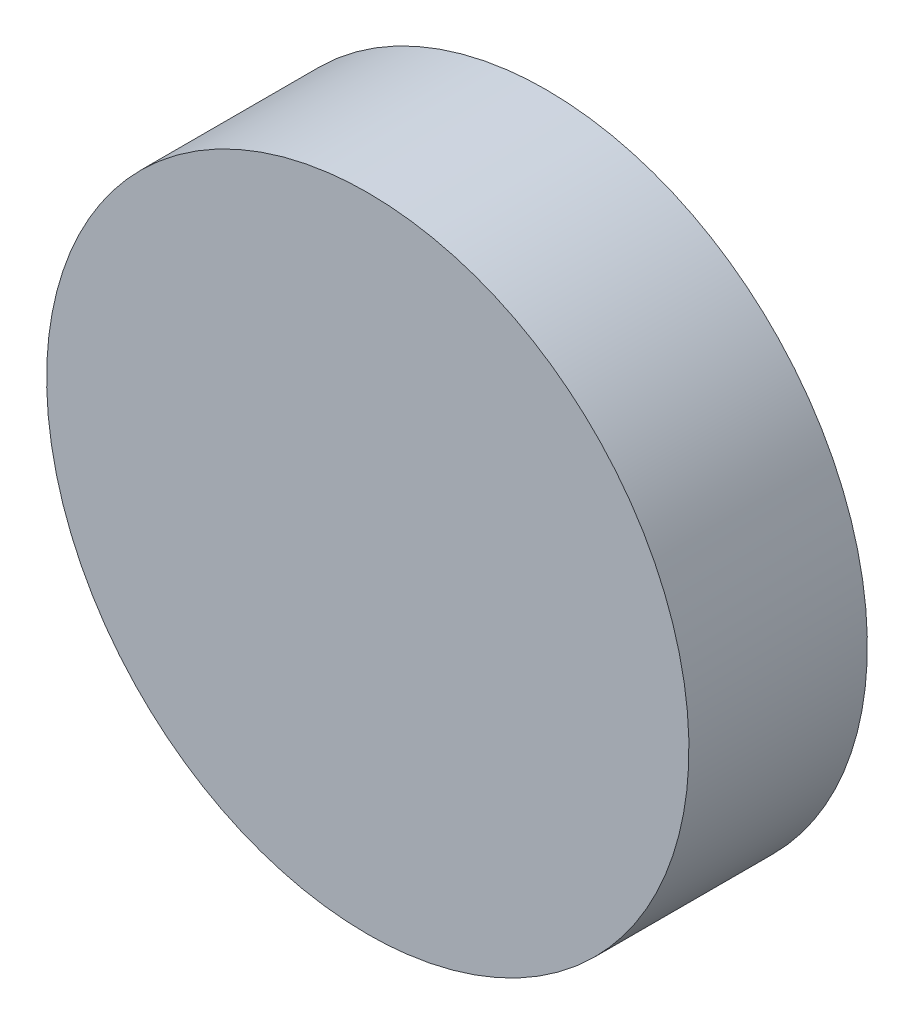
ISO-10303-21;
HEADER;
FILE_DESCRIPTION(('STEP AP214'),'2;1');
FILE_NAME('part.step','',(''),(''),'','','');
FILE_SCHEMA(('AUTOMOTIVE_DESIGN { 1 0 10303 214 1 1 1 1 }'));
ENDSEC;
DATA;
#1=APPLICATION_CONTEXT('core data for automotive mechanical design processes');
#2=APPLICATION_PROTOCOL_DEFINITION('international standard','automotive_design',2000,#1);
#3=PRODUCT_CONTEXT('',#1,'mechanical');
#4=PRODUCT('Part','Part','',(#3));
#5=PRODUCT_RELATED_PRODUCT_CATEGORY('part','',(#4));
#6=PRODUCT_DEFINITION_FORMATION('','',#4);
#7=PRODUCT_DEFINITION_CONTEXT('part definition',#1,'design');
#8=PRODUCT_DEFINITION('design','',#6,#7);
#9=PRODUCT_DEFINITION_SHAPE('','',#8);
#10=(LENGTH_UNIT() NAMED_UNIT(*) SI_UNIT(.MILLI.,.METRE.));
#11=(NAMED_UNIT(*) PLANE_ANGLE_UNIT() SI_UNIT($,.RADIAN.));
#12=(NAMED_UNIT(*) SI_UNIT($,.STERADIAN.) SOLID_ANGLE_UNIT());
#13=UNCERTAINTY_MEASURE_WITH_UNIT(LENGTH_MEASURE(1.E-05),#10,'distance_accuracy_value','');
#14=(GEOMETRIC_REPRESENTATION_CONTEXT(3) GLOBAL_UNCERTAINTY_ASSIGNED_CONTEXT((#13)) GLOBAL_UNIT_ASSIGNED_CONTEXT((#10,
#11,#12)) REPRESENTATION_CONTEXT('',''));
#15=CARTESIAN_POINT('',(0.,0.,0.));
#16=DIRECTION('',(0.,0.,1.));
#17=DIRECTION('',(1.,0.,0.));
#18=AXIS2_PLACEMENT_3D('',#15,#16,#17);
#19=CARTESIAN_POINT('',(-28.9527978690643,4.79877379608722,9.96771335056176E-07));
#20=CARTESIAN_POINT('',(-28.4955978690643,4.79877379063517,9.96771334579543E-07));
#21=CARTESIAN_POINT('',(-28.4955978636122,5.25597379063516,1.03674100853733E-06));
#22=CARTESIAN_POINT('',(-28.4955978581601,5.71317379063516,1.07671068249511E-06));
#23=CARTESIAN_POINT('',(-28.9527978581601,5.71317379608722,1.07671068297174E-06));
#24=CARTESIAN_POINT('',(-29.4099978581601,5.71317380153928,1.07671068344838E-06));
#25=CARTESIAN_POINT('',(-29.4099978636122,5.25597380153928,1.03674100949059E-06));
#26=CARTESIAN_POINT('',(-29.4099978690643,4.79877380153928,9.9677133553281E-07));
#27=CARTESIAN_POINT('',(-28.9527978690643,4.79877379608722,9.96771335056176E-07));
#28=CARTESIAN_POINT('',(-28.9527978690643,4.7987738182926,-0.253999003228664));
#29=CARTESIAN_POINT('',(-28.4955978690643,4.79877381284054,-0.253999003228664));
#30=CARTESIAN_POINT('',(-28.4955978636122,5.25597381284054,-0.253998963258991));
#31=CARTESIAN_POINT('',(-28.4955978581601,5.71317381284054,-0.253998923289317));
#32=CARTESIAN_POINT('',(-28.9527978581601,5.71317381829259,-0.253998923289316));
#33=CARTESIAN_POINT('',(-29.4099978581601,5.71317382374465,-0.253998923289316));
#34=CARTESIAN_POINT('',(-29.4099978636122,5.25597382374465,-0.25399896325899));
#35=CARTESIAN_POINT('',(-29.4099978690643,4.79877382374465,-0.253999003228663));
#36=CARTESIAN_POINT('',(-28.9527978690643,4.7987738182926,-0.253999003228664));
#37=(BOUNDED_SURFACE() B_SPLINE_SURFACE(1,2,((#19,#20,#21,#22,#23,#24,#25,#26,#27),(#28,#29,#30,
#31,#32,#33,#34,#35,#36)),.UNSPECIFIED.,.F.,.T.,.F.) B_SPLINE_SURFACE_WITH_KNOTS((2,2),(3,2,2,2,
3),(-0.555555555555555,0.),(-3.14159265358979,-1.5707963267949,0.,1.5707963267949,
3.14159265358979),.UNSPECIFIED.) GEOMETRIC_REPRESENTATION_ITEM() RATIONAL_B_SPLINE_SURFACE(((1.,
0.707106781186548,1.,0.707106781186548,1.,0.707106781186548,1.,0.707106781186548,1.),(1.,
0.707106781186548,1.,0.707106781186548,1.,0.707106781186548,1.,0.707106781186548,1.))) REPRESENTATION_ITEM('') SURFACE());
#38=CARTESIAN_POINT('',(-28.9527978581601,5.71317379608722,1.07671068297174E-06));
#39=CARTESIAN_POINT('',(-28.4955978581601,5.71317379063512,1.07671068249511E-06));
#40=CARTESIAN_POINT('',(-28.4955978636122,5.25597379063514,1.03674100853732E-06));
#41=CARTESIAN_POINT('',(-28.4955978690643,4.79877379063517,9.96771334579543E-07));
#42=CARTESIAN_POINT('',(-28.9527978690643,4.79877379608722,9.96771335056176E-07));
#43=(BOUNDED_CURVE() B_SPLINE_CURVE(2,(#38,#39,#40,#41,#42),.UNSPECIFIED.,.F.,
.F.) B_SPLINE_CURVE_WITH_KNOTS((3,2,3),(0.,1.57079632679495,3.1415926535898),
.UNSPECIFIED.) CURVE() GEOMETRIC_REPRESENTATION_ITEM() RATIONAL_B_SPLINE_CURVE((1.,
0.707106781186564,1.,0.707106781186554,1.)) REPRESENTATION_ITEM(''));
#44=CARTESIAN_POINT('',(-28.9527978581601,5.71317379608722,1.07671068297175E-06));
#45=VERTEX_POINT('',#44);
#46=CARTESIAN_POINT('',(-28.9527978690643,4.79877379608722,9.96771335056176E-07));
#47=VERTEX_POINT('',#46);
#48=EDGE_CURVE('E50',#45,#47,#43,.T.);
#49=CARTESIAN_POINT('',(-28.9527978690643,4.79877379608722,9.96771335056176E-07));
#50=CARTESIAN_POINT('',(-28.9527978690643,4.7987738182926,-0.253999003228664));
#51=(BOUNDED_CURVE() B_SPLINE_CURVE(1,(#49,#50),.UNSPECIFIED.,.F.,
.F.) B_SPLINE_CURVE_WITH_KNOTS((2,2),(0.,0.555555555555555),
.UNSPECIFIED.) CURVE() GEOMETRIC_REPRESENTATION_ITEM() RATIONAL_B_SPLINE_CURVE((1.,1.)) REPRESENTATION_ITEM(''));
#52=CARTESIAN_POINT('',(-28.9527978690643,4.7987738182926,-0.253999003228664));
#53=VERTEX_POINT('',#52);
#54=EDGE_CURVE('E11',#47,#53,#51,.T.);
#55=CARTESIAN_POINT('',(-28.9527978581601,5.7131738182926,-0.253998923289316));
#56=CARTESIAN_POINT('',(-28.4955978581601,5.7131738128405,-0.253998923289317));
#57=CARTESIAN_POINT('',(-28.4955978636122,5.25597381284052,-0.253998963258991));
#58=CARTESIAN_POINT('',(-28.4955978690643,4.79877381284055,-0.253999003228664));
#59=CARTESIAN_POINT('',(-28.9527978690643,4.7987738182926,-0.253999003228664));
#60=(BOUNDED_CURVE() B_SPLINE_CURVE(2,(#55,#56,#57,#58,#59),.UNSPECIFIED.,.F.,
.F.) B_SPLINE_CURVE_WITH_KNOTS((3,2,3),(0.,1.57079632679495,3.1415926535898),
.UNSPECIFIED.) CURVE() GEOMETRIC_REPRESENTATION_ITEM() RATIONAL_B_SPLINE_CURVE((1.,
0.707106781186564,1.,0.707106781186554,1.)) REPRESENTATION_ITEM(''));
#61=CARTESIAN_POINT('',(-28.9527978581601,5.7131738182926,-0.253998923289317));
#62=VERTEX_POINT('',#61);
#63=EDGE_CURVE('E48',#62,#53,#60,.T.);
#64=CARTESIAN_POINT('',(-28.9527978690643,4.7987738182926,-0.253999003228664));
#65=CARTESIAN_POINT('',(-29.4099978690643,4.79877382374466,-0.253999003228663));
#66=CARTESIAN_POINT('',(-29.4099978636122,5.25597382374468,-0.25399896325899));
#67=CARTESIAN_POINT('',(-29.4099978581601,5.7131738237447,-0.253998923289316));
#68=CARTESIAN_POINT('',(-28.9527978581601,5.7131738182926,-0.253998923289316));
#69=(BOUNDED_CURVE() B_SPLINE_CURVE(2,(#64,#65,#66,#67,#68),.UNSPECIFIED.,.F.,
.F.) B_SPLINE_CURVE_WITH_KNOTS((3,2,3),(3.1415926535898,4.71238898038474,6.28318530717969),
.UNSPECIFIED.) CURVE() GEOMETRIC_REPRESENTATION_ITEM() RATIONAL_B_SPLINE_CURVE((1.,
0.707106781186518,1.,0.70710678118653,1.)) REPRESENTATION_ITEM(''));
#70=EDGE_CURVE('E46',#53,#62,#69,.T.);
#71=CARTESIAN_POINT('',(-28.9527978690643,4.79877379608722,9.96771335056176E-07));
#72=CARTESIAN_POINT('',(-29.4099978690643,4.79877380153928,9.9677133553281E-07));
#73=CARTESIAN_POINT('',(-29.4099978636122,5.2559738015393,1.0367410094906E-06));
#74=CARTESIAN_POINT('',(-29.4099978581601,5.71317380153932,1.07671068344838E-06));
#75=CARTESIAN_POINT('',(-28.9527978581601,5.71317379608722,1.07671068297174E-06));
#76=(BOUNDED_CURVE() B_SPLINE_CURVE(2,(#71,#72,#73,#74,#75),.UNSPECIFIED.,.F.,
.F.) B_SPLINE_CURVE_WITH_KNOTS((3,2,3),(3.1415926535898,4.71238898038474,6.28318530717969),
.UNSPECIFIED.) CURVE() GEOMETRIC_REPRESENTATION_ITEM() RATIONAL_B_SPLINE_CURVE((1.,
0.707106781186518,1.,0.70710678118653,1.)) REPRESENTATION_ITEM(''));
#77=EDGE_CURVE('E30',#47,#45,#76,.T.);
#78=ORIENTED_EDGE('',*,*,#48,.T.);
#79=ORIENTED_EDGE('',*,*,#54,.T.);
#80=ORIENTED_EDGE('',*,*,#63,.F.);
#81=ORIENTED_EDGE('',*,*,#70,.F.);
#82=ORIENTED_EDGE('',*,*,#54,.F.);
#83=ORIENTED_EDGE('',*,*,#77,.T.);
#84=EDGE_LOOP('',(#78,#79,#80,#81,#82,#83));
#85=FACE_BOUND('',#84,.T.);
#86=ADVANCED_FACE('F17',(#85),#37,.T.);
#87=CARTESIAN_POINT('',(-29.5014378570698,5.80461380262974,1.08470461821553E-06));
#88=CARTESIAN_POINT('',(-28.4041578570697,5.80461378954481,1.08470461707161E-06));
#89=CARTESIAN_POINT('',(-29.5014378701547,4.70733380262963,9.88777400716842E-07));
#90=CARTESIAN_POINT('',(-28.4041578701546,4.7073337895447,9.88777399572921E-07));
#91=(BOUNDED_SURFACE() B_SPLINE_SURFACE(1,1,((#87,#88),(#89,#90)),.UNSPECIFIED.,.F.,.F.,
.F.) B_SPLINE_SURFACE_WITH_KNOTS((2,2),(2,2),(-9.14400000000639E-05,0.00100584000000005),
(-0.000548640000000101,0.000548640000000011),
.UNSPECIFIED.) GEOMETRIC_REPRESENTATION_ITEM() RATIONAL_B_SPLINE_SURFACE(((1.,1.),(1.,1.))) REPRESENTATION_ITEM('') SURFACE());
#92=ORIENTED_EDGE('',*,*,#48,.F.);
#93=ORIENTED_EDGE('',*,*,#77,.F.);
#94=EDGE_LOOP('',(#92,#93));
#95=FACE_BOUND('',#94,.T.);
#96=ADVANCED_FACE('F126',(#95),#91,.T.);
#97=CARTESIAN_POINT('',(-29.5014378701547,4.70733382483501,-0.253999011222598));
#98=CARTESIAN_POINT('',(-28.4041578701546,4.70733381175008,-0.253999011222599));
#99=CARTESIAN_POINT('',(-29.5014378570698,5.80461382483512,-0.253998915295381));
#100=CARTESIAN_POINT('',(-28.4041578570697,5.80461381175019,-0.253998915295382));
#101=(BOUNDED_SURFACE() B_SPLINE_SURFACE(1,1,((#97,#98),(#99,#100)),.UNSPECIFIED.,.F.,.F.,
.F.) B_SPLINE_SURFACE_WITH_KNOTS((2,2),(2,2),(-9.14400000000622E-05,0.00100584000000005),
(-0.000548640000000105,0.000548640000000011),
.UNSPECIFIED.) GEOMETRIC_REPRESENTATION_ITEM() RATIONAL_B_SPLINE_SURFACE(((1.,1.),(1.,1.))) REPRESENTATION_ITEM('') SURFACE());
#102=ORIENTED_EDGE('',*,*,#63,.T.);
#103=ORIENTED_EDGE('',*,*,#70,.T.);
#104=EDGE_LOOP('',(#102,#103));
#105=FACE_BOUND('',#104,.T.);
#106=ADVANCED_FACE('F19',(#105),#101,.T.);
#107=CLOSED_SHELL('',(#86,#96,#106));
#108=MANIFOLD_SOLID_BREP('B1',#107);
#109=ADVANCED_BREP_SHAPE_REPRESENTATION('',(#18,#108),#14);
#110=SHAPE_DEFINITION_REPRESENTATION(#9,#109);
ENDSEC;
END-ISO-10303-21;
